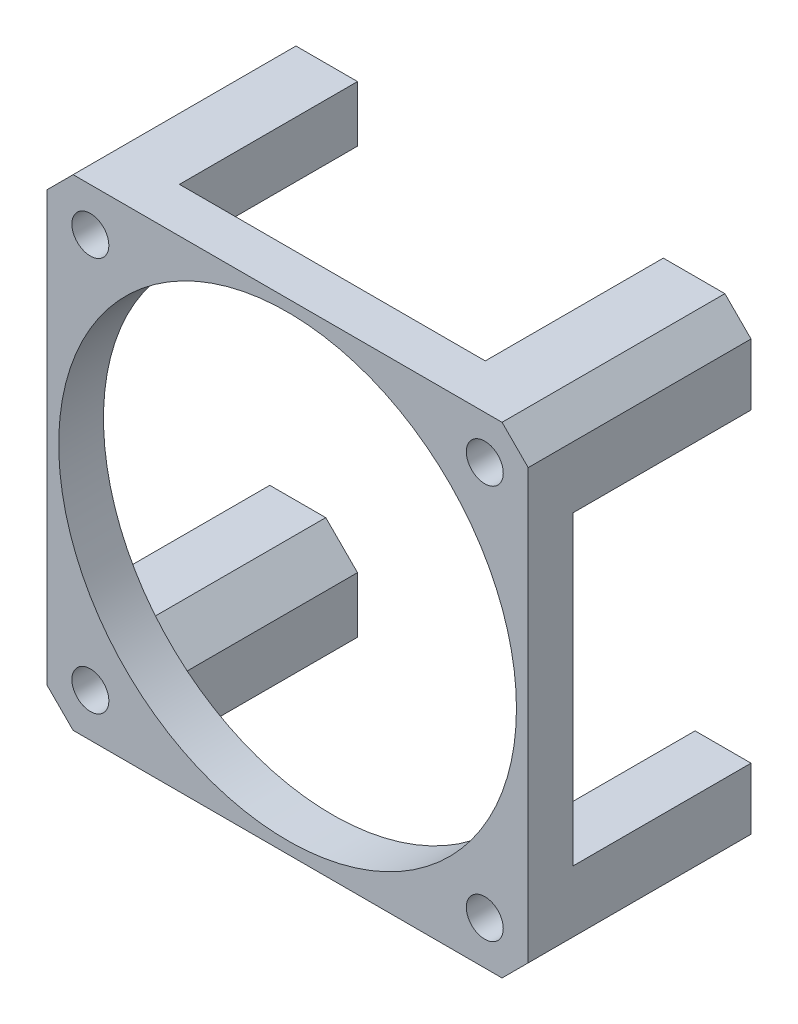
ISO-10303-21;
HEADER;
FILE_DESCRIPTION(('STEP AP214'),'2;1');
FILE_NAME('part.step','',(''),(''),'','','');
FILE_SCHEMA(('AUTOMOTIVE_DESIGN { 1 0 10303 214 1 1 1 1 }'));
ENDSEC;
DATA;
#1=APPLICATION_CONTEXT('core data for automotive mechanical design processes');
#2=APPLICATION_PROTOCOL_DEFINITION('international standard','automotive_design',2000,#1);
#3=PRODUCT_CONTEXT('',#1,'mechanical');
#4=PRODUCT('Part','Part','',(#3));
#5=PRODUCT_RELATED_PRODUCT_CATEGORY('part','',(#4));
#6=PRODUCT_DEFINITION_FORMATION('','',#4);
#7=PRODUCT_DEFINITION_CONTEXT('part definition',#1,'design');
#8=PRODUCT_DEFINITION('design','',#6,#7);
#9=PRODUCT_DEFINITION_SHAPE('','',#8);
#10=(LENGTH_UNIT() NAMED_UNIT(*) SI_UNIT(.MILLI.,.METRE.));
#11=(NAMED_UNIT(*) PLANE_ANGLE_UNIT() SI_UNIT($,.RADIAN.));
#12=(NAMED_UNIT(*) SI_UNIT($,.STERADIAN.) SOLID_ANGLE_UNIT());
#13=UNCERTAINTY_MEASURE_WITH_UNIT(LENGTH_MEASURE(1.E-05),#10,'distance_accuracy_value','');
#14=(GEOMETRIC_REPRESENTATION_CONTEXT(3) GLOBAL_UNCERTAINTY_ASSIGNED_CONTEXT((#13)) GLOBAL_UNIT_ASSIGNED_CONTEXT((#10,
#11,#12)) REPRESENTATION_CONTEXT('',''));
#15=CARTESIAN_POINT('',(0.,0.,0.));
#16=DIRECTION('',(0.,0.,1.));
#17=DIRECTION('',(1.,0.,0.));
#18=AXIS2_PLACEMENT_3D('',#15,#16,#17);
#19=CARTESIAN_POINT('',(0.,0.,0.));
#20=DIRECTION('',(0.,0.,1.));
#21=DIRECTION('',(1.,0.,0.));
#22=AXIS2_PLACEMENT_3D('',#19,#20,#21);
#23=PLANE('',#22);
#24=CARTESIAN_POINT('',(0.,0.,0.));
#25=DIRECTION('',(0.,0.,1.));
#26=DIRECTION('',(1.,0.,0.));
#27=AXIS2_PLACEMENT_3D('',#24,#25,#26);
#28=CIRCLE('',#27,20.45);
#29=CARTESIAN_POINT('',(20.45,0.,0.));
#30=VERTEX_POINT('',#29);
#31=EDGE_CURVE('E424',#30,#30,#28,.T.);
#32=ORIENTED_EDGE('',*,*,#31,.T.);
#33=EDGE_LOOP('',(#32));
#34=FACE_BOUND('',#33,.T.);
#35=DIRECTION('',(1.,0.,0.));
#36=VECTOR('',#35,1.);
#37=CARTESIAN_POINT('',(0.,-21.5,0.));
#38=LINE('',#37,#36);
#39=CARTESIAN_POINT('',(-13.6622023786411,-21.5,0.));
#40=VERTEX_POINT('',#39);
#41=CARTESIAN_POINT('',(13.6622023786411,-21.5,0.));
#42=VERTEX_POINT('',#41);
#43=EDGE_CURVE('E473',#40,#42,#38,.T.);
#44=ORIENTED_EDGE('',*,*,#43,.F.);
#45=DIRECTION('',(0.,1.,0.));
#46=VECTOR('',#45,1.);
#47=CARTESIAN_POINT('',(-13.6622023786411,0.,0.));
#48=LINE('',#47,#46);
#49=CARTESIAN_POINT('',(-13.6622023786411,-16.5,0.));
#50=VERTEX_POINT('',#49);
#51=EDGE_CURVE('E63',#40,#50,#48,.T.);
#52=ORIENTED_EDGE('',*,*,#51,.T.);
#53=DIRECTION('',(-0.707106781186548,0.707106781186548,0.));
#54=VECTOR('',#53,1.);
#55=CARTESIAN_POINT('',(-15.0811011893205,-15.0811011893205,0.));
#56=LINE('',#55,#54);
#57=CARTESIAN_POINT('',(-16.5,-13.6622023786411,0.));
#58=VERTEX_POINT('',#57);
#59=EDGE_CURVE('E213',#50,#58,#56,.T.);
#60=ORIENTED_EDGE('',*,*,#59,.T.);
#61=DIRECTION('',(1.,0.,0.));
#62=VECTOR('',#61,1.);
#63=CARTESIAN_POINT('',(0.,-13.6622023786411,0.));
#64=LINE('',#63,#62);
#65=CARTESIAN_POINT('',(-21.5,-13.6622023786411,0.));
#66=VERTEX_POINT('',#65);
#67=EDGE_CURVE('E238',#66,#58,#64,.T.);
#68=ORIENTED_EDGE('',*,*,#67,.F.);
#69=DIRECTION('',(0.,-1.,0.));
#70=VECTOR('',#69,1.);
#71=CARTESIAN_POINT('',(-21.5,0.,0.));
#72=LINE('',#71,#70);
#73=CARTESIAN_POINT('',(-21.5,13.6622023786411,0.));
#74=VERTEX_POINT('',#73);
#75=EDGE_CURVE('E469',#74,#66,#72,.T.);
#76=ORIENTED_EDGE('',*,*,#75,.F.);
#77=DIRECTION('',(1.,0.,0.));
#78=VECTOR('',#77,1.);
#79=CARTESIAN_POINT('',(0.,13.6622023786411,0.));
#80=LINE('',#79,#78);
#81=CARTESIAN_POINT('',(-16.5,13.6622023786411,0.));
#82=VERTEX_POINT('',#81);
#83=EDGE_CURVE('E71',#74,#82,#80,.T.);
#84=ORIENTED_EDGE('',*,*,#83,.T.);
#85=DIRECTION('',(0.707106781186546,0.707106781186549,0.));
#86=VECTOR('',#85,1.);
#87=CARTESIAN_POINT('',(-15.0811011893206,15.0811011893205,0.));
#88=LINE('',#87,#86);
#89=CARTESIAN_POINT('',(-13.6622023786411,16.5,0.));
#90=VERTEX_POINT('',#89);
#91=EDGE_CURVE('E262',#82,#90,#88,.T.);
#92=ORIENTED_EDGE('',*,*,#91,.T.);
#93=DIRECTION('',(0.,1.,0.));
#94=VECTOR('',#93,1.);
#95=CARTESIAN_POINT('',(-13.6622023786411,0.,0.));
#96=LINE('',#95,#94);
#97=CARTESIAN_POINT('',(-13.6622023786411,21.5,0.));
#98=VERTEX_POINT('',#97);
#99=EDGE_CURVE('E300',#90,#98,#96,.T.);
#100=ORIENTED_EDGE('',*,*,#99,.T.);
#101=DIRECTION('',(-1.,0.,0.));
#102=VECTOR('',#101,1.);
#103=CARTESIAN_POINT('',(0.,21.5,0.));
#104=LINE('',#103,#102);
#105=CARTESIAN_POINT('',(13.6622023786411,21.5,0.));
#106=VERTEX_POINT('',#105);
#107=EDGE_CURVE('E408',#106,#98,#104,.T.);
#108=ORIENTED_EDGE('',*,*,#107,.F.);
#109=DIRECTION('',(0.,-1.,0.));
#110=VECTOR('',#109,1.);
#111=CARTESIAN_POINT('',(13.6622023786411,0.,0.));
#112=LINE('',#111,#110);
#113=CARTESIAN_POINT('',(13.6622023786411,16.5,0.));
#114=VERTEX_POINT('',#113);
#115=EDGE_CURVE('E323',#106,#114,#112,.T.);
#116=ORIENTED_EDGE('',*,*,#115,.T.);
#117=DIRECTION('',(-0.707106781186548,0.707106781186548,0.));
#118=VECTOR('',#117,1.);
#119=CARTESIAN_POINT('',(15.0811011893206,15.0811011893206,0.));
#120=LINE('',#119,#118);
#121=CARTESIAN_POINT('',(16.5,13.6622023786411,0.));
#122=VERTEX_POINT('',#121);
#123=EDGE_CURVE('E309',#122,#114,#120,.T.);
#124=ORIENTED_EDGE('',*,*,#123,.F.);
#125=DIRECTION('',(-1.,0.,0.));
#126=VECTOR('',#125,1.);
#127=CARTESIAN_POINT('',(0.,13.6622023786411,0.));
#128=LINE('',#127,#126);
#129=CARTESIAN_POINT('',(21.5,13.6622023786411,0.));
#130=VERTEX_POINT('',#129);
#131=EDGE_CURVE('E349',#130,#122,#128,.T.);
#132=ORIENTED_EDGE('',*,*,#131,.F.);
#133=DIRECTION('',(0.,1.,0.));
#134=VECTOR('',#133,1.);
#135=CARTESIAN_POINT('',(21.5,0.,0.));
#136=LINE('',#135,#134);
#137=CARTESIAN_POINT('',(21.5,-13.6622023786411,0.));
#138=VERTEX_POINT('',#137);
#139=EDGE_CURVE('E476',#138,#130,#136,.T.);
#140=ORIENTED_EDGE('',*,*,#139,.F.);
#141=DIRECTION('',(-1.,0.,0.));
#142=VECTOR('',#141,1.);
#143=CARTESIAN_POINT('',(0.,-13.6622023786411,0.));
#144=LINE('',#143,#142);
#145=CARTESIAN_POINT('',(16.5,-13.6622023786411,0.));
#146=VERTEX_POINT('',#145);
#147=EDGE_CURVE('E373',#138,#146,#144,.T.);
#148=ORIENTED_EDGE('',*,*,#147,.T.);
#149=DIRECTION('',(0.707106781186548,0.707106781186548,0.));
#150=VECTOR('',#149,1.);
#151=CARTESIAN_POINT('',(15.0811011893205,-15.0811011893205,0.));
#152=LINE('',#151,#150);
#153=CARTESIAN_POINT('',(13.6622023786411,-16.5,0.));
#154=VERTEX_POINT('',#153);
#155=EDGE_CURVE('E358',#154,#146,#152,.T.);
#156=ORIENTED_EDGE('',*,*,#155,.F.);
#157=DIRECTION('',(0.,1.,0.));
#158=VECTOR('',#157,1.);
#159=CARTESIAN_POINT('',(13.6622023786411,0.,0.));
#160=LINE('',#159,#158);
#161=EDGE_CURVE('E398',#42,#154,#160,.T.);
#162=ORIENTED_EDGE('',*,*,#161,.F.);
#163=EDGE_LOOP('',(#44,#52,#60,#68,#76,#84,#92,#100,#108,#116,#124,#132,#140,#148,#156,#162));
#164=FACE_BOUND('',#163,.T.);
#165=ADVANCED_FACE('F47',(#34,#164),#23,.F.);
#166=CARTESIAN_POINT('',(0.,21.5,4.));
#167=DIRECTION('',(0.,-1.,0.));
#168=DIRECTION('',(0.,0.,-1.));
#169=AXIS2_PLACEMENT_3D('',#166,#167,#168);
#170=PLANE('',#169);
#171=DIRECTION('',(0.,0.,-1.));
#172=VECTOR('',#171,1.);
#173=CARTESIAN_POINT('',(19.1622023786411,21.5,4.));
#174=LINE('',#173,#172);
#175=CARTESIAN_POINT('',(19.1622023786411,21.5,4.));
#176=VERTEX_POINT('',#175);
#177=CARTESIAN_POINT('',(19.1622023786411,21.5,-15.91));
#178=VERTEX_POINT('',#177);
#179=EDGE_CURVE('E465',#176,#178,#174,.T.);
#180=ORIENTED_EDGE('',*,*,#179,.T.);
#181=DIRECTION('',(-1.,0.,0.));
#182=VECTOR('',#181,1.);
#183=CARTESIAN_POINT('',(0.,21.5,-15.91));
#184=LINE('',#183,#182);
#185=CARTESIAN_POINT('',(13.6622023786411,21.5,-15.91));
#186=VERTEX_POINT('',#185);
#187=EDGE_CURVE('E337',#178,#186,#184,.T.);
#188=ORIENTED_EDGE('',*,*,#187,.T.);
#189=DIRECTION('',(0.,0.,1.));
#190=VECTOR('',#189,1.);
#191=CARTESIAN_POINT('',(13.6622023786411,21.5,-15.91));
#192=LINE('',#191,#190);
#193=EDGE_CURVE('E359',#186,#106,#192,.T.);
#194=ORIENTED_EDGE('',*,*,#193,.T.);
#195=ORIENTED_EDGE('',*,*,#107,.T.);
#196=DIRECTION('',(0.,0.,1.));
#197=VECTOR('',#196,1.);
#198=CARTESIAN_POINT('',(-13.6622023786411,21.5,-15.91));
#199=LINE('',#198,#197);
#200=CARTESIAN_POINT('',(-13.6622023786411,21.5,-15.91));
#201=VERTEX_POINT('',#200);
#202=EDGE_CURVE('E313',#201,#98,#199,.T.);
#203=ORIENTED_EDGE('',*,*,#202,.F.);
#204=DIRECTION('',(-1.,0.,0.));
#205=VECTOR('',#204,1.);
#206=CARTESIAN_POINT('',(0.,21.5,-15.91));
#207=LINE('',#206,#205);
#208=CARTESIAN_POINT('',(-19.1622023786411,21.5,-15.91));
#209=VERTEX_POINT('',#208);
#210=EDGE_CURVE('E280',#201,#209,#207,.T.);
#211=ORIENTED_EDGE('',*,*,#210,.T.);
#212=DIRECTION('',(0.,0.,-1.));
#213=VECTOR('',#212,1.);
#214=CARTESIAN_POINT('',(-19.1622023786411,21.5,4.));
#215=LINE('',#214,#213);
#216=CARTESIAN_POINT('',(-19.1622023786411,21.5,4.));
#217=VERTEX_POINT('',#216);
#218=EDGE_CURVE('E11',#217,#209,#215,.T.);
#219=ORIENTED_EDGE('',*,*,#218,.F.);
#220=DIRECTION('',(-1.,0.,0.));
#221=VECTOR('',#220,1.);
#222=CARTESIAN_POINT('',(0.,21.5,4.));
#223=LINE('',#222,#221);
#224=EDGE_CURVE('E419',#176,#217,#223,.T.);
#225=ORIENTED_EDGE('',*,*,#224,.F.);
#226=EDGE_LOOP('',(#180,#188,#194,#195,#203,#211,#219,#225));
#227=FACE_BOUND('',#226,.T.);
#228=ADVANCED_FACE('F49',(#227),#170,.F.);
#229=CARTESIAN_POINT('',(-20.3311011893205,20.3311011893205,4.));
#230=DIRECTION('',(0.707106781186547,-0.707106781186547,0.));
#231=DIRECTION('',(0.707106781186548,0.707106781186548,0.));
#232=AXIS2_PLACEMENT_3D('',#229,#230,#231);
#233=PLANE('',#232);
#234=ORIENTED_EDGE('',*,*,#218,.T.);
#235=DIRECTION('',(-0.707106781186548,-0.707106781186548,0.));
#236=VECTOR('',#235,1.);
#237=CARTESIAN_POINT('',(-20.3311011893205,20.3311011893205,-15.91));
#238=LINE('',#237,#236);
#239=CARTESIAN_POINT('',(-21.5,19.1622023786411,-15.91));
#240=VERTEX_POINT('',#239);
#241=EDGE_CURVE('E284',#209,#240,#238,.T.);
#242=ORIENTED_EDGE('',*,*,#241,.T.);
#243=DIRECTION('',(0.,0.,-1.));
#244=VECTOR('',#243,1.);
#245=CARTESIAN_POINT('',(-21.5,19.1622023786411,4.));
#246=LINE('',#245,#244);
#247=CARTESIAN_POINT('',(-21.5,19.1622023786411,4.));
#248=VERTEX_POINT('',#247);
#249=EDGE_CURVE('E56',#248,#240,#246,.T.);
#250=ORIENTED_EDGE('',*,*,#249,.F.);
#251=DIRECTION('',(-0.707106781186548,-0.707106781186548,0.));
#252=VECTOR('',#251,1.);
#253=CARTESIAN_POINT('',(-20.3311011893205,20.3311011893205,4.));
#254=LINE('',#253,#252);
#255=EDGE_CURVE('E423',#217,#248,#254,.T.);
#256=ORIENTED_EDGE('',*,*,#255,.F.);
#257=EDGE_LOOP('',(#234,#242,#250,#256));
#258=FACE_BOUND('',#257,.T.);
#259=ADVANCED_FACE('F513',(#258),#233,.F.);
#260=CARTESIAN_POINT('',(-21.5,0.,4.));
#261=DIRECTION('',(1.,0.,0.));
#262=DIRECTION('',(0.,0.,-1.));
#263=AXIS2_PLACEMENT_3D('',#260,#261,#262);
#264=PLANE('',#263);
#265=ORIENTED_EDGE('',*,*,#249,.T.);
#266=DIRECTION('',(0.,-1.,0.));
#267=VECTOR('',#266,1.);
#268=CARTESIAN_POINT('',(-21.5,0.,-15.91));
#269=LINE('',#268,#267);
#270=CARTESIAN_POINT('',(-21.5,13.6622023786411,-15.91));
#271=VERTEX_POINT('',#270);
#272=EDGE_CURVE('E288',#240,#271,#269,.T.);
#273=ORIENTED_EDGE('',*,*,#272,.T.);
#274=DIRECTION('',(0.,0.,1.));
#275=VECTOR('',#274,1.);
#276=CARTESIAN_POINT('',(-21.5,13.6622023786411,-15.91));
#277=LINE('',#276,#275);
#278=EDGE_CURVE('E310',#271,#74,#277,.T.);
#279=ORIENTED_EDGE('',*,*,#278,.T.);
#280=ORIENTED_EDGE('',*,*,#75,.T.);
#281=DIRECTION('',(0.,0.,1.));
#282=VECTOR('',#281,1.);
#283=CARTESIAN_POINT('',(-21.5,-13.6622023786411,-15.91));
#284=LINE('',#283,#282);
#285=CARTESIAN_POINT('',(-21.5,-13.6622023786411,-15.91));
#286=VERTEX_POINT('',#285);
#287=EDGE_CURVE('E263',#286,#66,#284,.T.);
#288=ORIENTED_EDGE('',*,*,#287,.F.);
#289=DIRECTION('',(0.,-1.,0.));
#290=VECTOR('',#289,1.);
#291=CARTESIAN_POINT('',(-21.5,0.,-15.91));
#292=LINE('',#291,#290);
#293=CARTESIAN_POINT('',(-21.5,-19.1622023786411,-15.91));
#294=VERTEX_POINT('',#293);
#295=EDGE_CURVE('E243',#286,#294,#292,.T.);
#296=ORIENTED_EDGE('',*,*,#295,.T.);
#297=DIRECTION('',(0.,0.,-1.));
#298=VECTOR('',#297,1.);
#299=CARTESIAN_POINT('',(-21.5,-19.1622023786411,4.));
#300=LINE('',#299,#298);
#301=CARTESIAN_POINT('',(-21.5,-19.1622023786411,4.));
#302=VERTEX_POINT('',#301);
#303=EDGE_CURVE('E497',#302,#294,#300,.T.);
#304=ORIENTED_EDGE('',*,*,#303,.F.);
#305=DIRECTION('',(0.,-1.,0.));
#306=VECTOR('',#305,1.);
#307=CARTESIAN_POINT('',(-21.5,0.,4.));
#308=LINE('',#307,#306);
#309=EDGE_CURVE('E427',#248,#302,#308,.T.);
#310=ORIENTED_EDGE('',*,*,#309,.F.);
#311=EDGE_LOOP('',(#265,#273,#279,#280,#288,#296,#304,#310));
#312=FACE_BOUND('',#311,.T.);
#313=ADVANCED_FACE('F504',(#312),#264,.F.);
#314=CARTESIAN_POINT('',(-20.3311011893205,-20.3311011893205,4.));
#315=DIRECTION('',(0.707106781186547,0.707106781186547,0.));
#316=DIRECTION('',(-0.707106781186548,0.707106781186548,0.));
#317=AXIS2_PLACEMENT_3D('',#314,#315,#316);
#318=PLANE('',#317);
#319=ORIENTED_EDGE('',*,*,#303,.T.);
#320=DIRECTION('',(0.707106781186548,-0.707106781186548,0.));
#321=VECTOR('',#320,1.);
#322=CARTESIAN_POINT('',(-20.3311011893205,-20.3311011893205,-15.91));
#323=LINE('',#322,#321);
#324=CARTESIAN_POINT('',(-19.1622023786411,-21.5,-15.91));
#325=VERTEX_POINT('',#324);
#326=EDGE_CURVE('E247',#294,#325,#323,.T.);
#327=ORIENTED_EDGE('',*,*,#326,.T.);
#328=DIRECTION('',(0.,0.,-1.));
#329=VECTOR('',#328,1.);
#330=CARTESIAN_POINT('',(-19.1622023786411,-21.5,4.));
#331=LINE('',#330,#329);
#332=CARTESIAN_POINT('',(-19.1622023786411,-21.5,4.));
#333=VERTEX_POINT('',#332);
#334=EDGE_CURVE('E494',#333,#325,#331,.T.);
#335=ORIENTED_EDGE('',*,*,#334,.F.);
#336=DIRECTION('',(0.707106781186548,-0.707106781186548,0.));
#337=VECTOR('',#336,1.);
#338=CARTESIAN_POINT('',(-20.3311011893205,-20.3311011893205,4.));
#339=LINE('',#338,#337);
#340=EDGE_CURVE('E430',#302,#333,#339,.T.);
#341=ORIENTED_EDGE('',*,*,#340,.F.);
#342=EDGE_LOOP('',(#319,#327,#335,#341));
#343=FACE_BOUND('',#342,.T.);
#344=ADVANCED_FACE('F535',(#343),#318,.F.);
#345=CARTESIAN_POINT('',(0.,-21.5,4.));
#346=DIRECTION('',(0.,1.,0.));
#347=DIRECTION('',(0.,0.,1.));
#348=AXIS2_PLACEMENT_3D('',#345,#346,#347);
#349=PLANE('',#348);
#350=ORIENTED_EDGE('',*,*,#334,.T.);
#351=DIRECTION('',(1.,0.,0.));
#352=VECTOR('',#351,1.);
#353=CARTESIAN_POINT('',(0.,-21.5,-15.91));
#354=LINE('',#353,#352);
#355=CARTESIAN_POINT('',(-13.6622023786411,-21.5,-15.91));
#356=VERTEX_POINT('',#355);
#357=EDGE_CURVE('E217',#325,#356,#354,.T.);
#358=ORIENTED_EDGE('',*,*,#357,.T.);
#359=DIRECTION('',(0.,0.,1.));
#360=VECTOR('',#359,1.);
#361=CARTESIAN_POINT('',(-13.6622023786411,-21.5,-15.91));
#362=LINE('',#361,#360);
#363=EDGE_CURVE('E232',#356,#40,#362,.T.);
#364=ORIENTED_EDGE('',*,*,#363,.T.);
#365=ORIENTED_EDGE('',*,*,#43,.T.);
#366=DIRECTION('',(0.,0.,1.));
#367=VECTOR('',#366,1.);
#368=CARTESIAN_POINT('',(13.6622023786411,-21.5,-15.91));
#369=LINE('',#368,#367);
#370=CARTESIAN_POINT('',(13.6622023786411,-21.5,-15.91));
#371=VERTEX_POINT('',#370);
#372=EDGE_CURVE('E412',#371,#42,#369,.T.);
#373=ORIENTED_EDGE('',*,*,#372,.F.);
#374=DIRECTION('',(1.,0.,0.));
#375=VECTOR('',#374,1.);
#376=CARTESIAN_POINT('',(0.,-21.5,-15.91));
#377=LINE('',#376,#375);
#378=CARTESIAN_POINT('',(19.1622023786411,-21.5,-15.91));
#379=VERTEX_POINT('',#378);
#380=EDGE_CURVE('E379',#371,#379,#377,.T.);
#381=ORIENTED_EDGE('',*,*,#380,.T.);
#382=DIRECTION('',(0.,0.,-1.));
#383=VECTOR('',#382,1.);
#384=CARTESIAN_POINT('',(19.1622023786411,-21.5,4.));
#385=LINE('',#384,#383);
#386=CARTESIAN_POINT('',(19.1622023786411,-21.5,4.));
#387=VERTEX_POINT('',#386);
#388=EDGE_CURVE('E491',#387,#379,#385,.T.);
#389=ORIENTED_EDGE('',*,*,#388,.F.);
#390=DIRECTION('',(1.,0.,0.));
#391=VECTOR('',#390,1.);
#392=CARTESIAN_POINT('',(0.,-21.5,4.));
#393=LINE('',#392,#391);
#394=EDGE_CURVE('E433',#333,#387,#393,.T.);
#395=ORIENTED_EDGE('',*,*,#394,.F.);
#396=EDGE_LOOP('',(#350,#358,#364,#365,#373,#381,#389,#395));
#397=FACE_BOUND('',#396,.T.);
#398=ADVANCED_FACE('F586',(#397),#349,.F.);
#399=CARTESIAN_POINT('',(20.3311011893205,-20.3311011893205,4.));
#400=DIRECTION('',(-0.707106781186547,0.707106781186547,0.));
#401=DIRECTION('',(-0.707106781186548,-0.707106781186548,0.));
#402=AXIS2_PLACEMENT_3D('',#399,#400,#401);
#403=PLANE('',#402);
#404=ORIENTED_EDGE('',*,*,#388,.T.);
#405=DIRECTION('',(0.707106781186548,0.707106781186548,0.));
#406=VECTOR('',#405,1.);
#407=CARTESIAN_POINT('',(20.3311011893205,-20.3311011893205,-15.91));
#408=LINE('',#407,#406);
#409=CARTESIAN_POINT('',(21.5,-19.1622023786411,-15.91));
#410=VERTEX_POINT('',#409);
#411=EDGE_CURVE('E383',#379,#410,#408,.T.);
#412=ORIENTED_EDGE('',*,*,#411,.T.);
#413=DIRECTION('',(0.,0.,-1.));
#414=VECTOR('',#413,1.);
#415=CARTESIAN_POINT('',(21.5,-19.1622023786411,4.));
#416=LINE('',#415,#414);
#417=CARTESIAN_POINT('',(21.5,-19.1622023786411,4.));
#418=VERTEX_POINT('',#417);
#419=EDGE_CURVE('E488',#418,#410,#416,.T.);
#420=ORIENTED_EDGE('',*,*,#419,.F.);
#421=DIRECTION('',(0.707106781186548,0.707106781186548,0.));
#422=VECTOR('',#421,1.);
#423=CARTESIAN_POINT('',(20.3311011893205,-20.3311011893205,4.));
#424=LINE('',#423,#422);
#425=EDGE_CURVE('E436',#387,#418,#424,.T.);
#426=ORIENTED_EDGE('',*,*,#425,.F.);
#427=EDGE_LOOP('',(#404,#412,#420,#426));
#428=FACE_BOUND('',#427,.T.);
#429=ADVANCED_FACE('F591',(#428),#403,.F.);
#430=CARTESIAN_POINT('',(21.5,0.,4.));
#431=DIRECTION('',(-1.,0.,0.));
#432=DIRECTION('',(0.,0.,1.));
#433=AXIS2_PLACEMENT_3D('',#430,#431,#432);
#434=PLANE('',#433);
#435=ORIENTED_EDGE('',*,*,#419,.T.);
#436=DIRECTION('',(0.,1.,0.));
#437=VECTOR('',#436,1.);
#438=CARTESIAN_POINT('',(21.5,0.,-15.91));
#439=LINE('',#438,#437);
#440=CARTESIAN_POINT('',(21.5,-13.6622023786411,-15.91));
#441=VERTEX_POINT('',#440);
#442=EDGE_CURVE('E387',#410,#441,#439,.T.);
#443=ORIENTED_EDGE('',*,*,#442,.T.);
#444=DIRECTION('',(0.,0.,1.));
#445=VECTOR('',#444,1.);
#446=CARTESIAN_POINT('',(21.5,-13.6622023786411,-15.91));
#447=LINE('',#446,#445);
#448=EDGE_CURVE('E409',#441,#138,#447,.T.);
#449=ORIENTED_EDGE('',*,*,#448,.T.);
#450=ORIENTED_EDGE('',*,*,#139,.T.);
#451=DIRECTION('',(0.,0.,1.));
#452=VECTOR('',#451,1.);
#453=CARTESIAN_POINT('',(21.5,13.6622023786411,-15.91));
#454=LINE('',#453,#452);
#455=CARTESIAN_POINT('',(21.5,13.6622023786411,-15.91));
#456=VERTEX_POINT('',#455);
#457=EDGE_CURVE('E362',#456,#130,#454,.T.);
#458=ORIENTED_EDGE('',*,*,#457,.F.);
#459=DIRECTION('',(0.,1.,0.));
#460=VECTOR('',#459,1.);
#461=CARTESIAN_POINT('',(21.5,0.,-15.91));
#462=LINE('',#461,#460);
#463=CARTESIAN_POINT('',(21.5,19.1622023786411,-15.91));
#464=VERTEX_POINT('',#463);
#465=EDGE_CURVE('E329',#456,#464,#462,.T.);
#466=ORIENTED_EDGE('',*,*,#465,.T.);
#467=DIRECTION('',(0.,0.,-1.));
#468=VECTOR('',#467,1.);
#469=CARTESIAN_POINT('',(21.5,19.1622023786411,4.));
#470=LINE('',#469,#468);
#471=CARTESIAN_POINT('',(21.5,19.1622023786411,4.));
#472=VERTEX_POINT('',#471);
#473=EDGE_CURVE('E485',#472,#464,#470,.T.);
#474=ORIENTED_EDGE('',*,*,#473,.F.);
#475=DIRECTION('',(0.,1.,0.));
#476=VECTOR('',#475,1.);
#477=CARTESIAN_POINT('',(21.5,0.,4.));
#478=LINE('',#477,#476);
#479=EDGE_CURVE('E439',#418,#472,#478,.T.);
#480=ORIENTED_EDGE('',*,*,#479,.F.);
#481=EDGE_LOOP('',(#435,#443,#449,#450,#458,#466,#474,#480));
#482=FACE_BOUND('',#481,.T.);
#483=ADVANCED_FACE('F569',(#482),#434,.F.);
#484=CARTESIAN_POINT('',(-17.62115687683,-17.62115687683,4.));
#485=DIRECTION('',(0.,0.,-1.));
#486=DIRECTION('',(-1.,0.,0.));
#487=AXIS2_PLACEMENT_3D('',#484,#485,#486);
#488=CYLINDRICAL_SURFACE('',#487,1.65008079549024);
#489=CARTESIAN_POINT('',(-17.62115687683,-17.62115687683,4.));
#490=DIRECTION('',(0.,0.,1.));
#491=DIRECTION('',(1.,0.,0.));
#492=AXIS2_PLACEMENT_3D('',#489,#490,#491);
#493=CIRCLE('',#492,1.65008079549024);
#494=CARTESIAN_POINT('',(-15.9710760813397,-17.62115687683,4.));
#495=VERTEX_POINT('',#494);
#496=EDGE_CURVE('E457',#495,#495,#493,.T.);
#497=ORIENTED_EDGE('',*,*,#496,.T.);
#498=EDGE_LOOP('',(#497));
#499=FACE_BOUND('',#498,.T.);
#500=CARTESIAN_POINT('',(-17.62115687683,-17.62115687683,-15.91));
#501=DIRECTION('',(0.,0.,1.));
#502=DIRECTION('',(1.,0.,0.));
#503=AXIS2_PLACEMENT_3D('',#500,#501,#502);
#504=CIRCLE('',#503,1.65008079549024);
#505=CARTESIAN_POINT('',(-15.9710760813397,-17.62115687683,-15.91));
#506=VERTEX_POINT('',#505);
#507=EDGE_CURVE('E234',#506,#506,#504,.T.);
#508=ORIENTED_EDGE('',*,*,#507,.F.);
#509=EDGE_LOOP('',(#508));
#510=FACE_BOUND('',#509,.T.);
#511=ADVANCED_FACE('F619',(#499,#510),#488,.F.);
#512=CARTESIAN_POINT('',(17.62115687683,-17.62115687683,4.));
#513=DIRECTION('',(0.,0.,-1.));
#514=DIRECTION('',(-1.,0.,0.));
#515=AXIS2_PLACEMENT_3D('',#512,#513,#514);
#516=CYLINDRICAL_SURFACE('',#515,1.65);
#517=CARTESIAN_POINT('',(17.62115687683,-17.62115687683,4.));
#518=DIRECTION('',(0.,0.,1.));
#519=DIRECTION('',(1.,0.,0.));
#520=AXIS2_PLACEMENT_3D('',#517,#518,#519);
#521=CIRCLE('',#520,1.65);
#522=CARTESIAN_POINT('',(19.27115687683,-17.62115687683,4.));
#523=VERTEX_POINT('',#522);
#524=EDGE_CURVE('E453',#523,#523,#521,.T.);
#525=ORIENTED_EDGE('',*,*,#524,.T.);
#526=EDGE_LOOP('',(#525));
#527=FACE_BOUND('',#526,.T.);
#528=CARTESIAN_POINT('',(17.62115687683,-17.62115687683,-15.91));
#529=DIRECTION('',(0.,0.,1.));
#530=DIRECTION('',(1.,0.,0.));
#531=AXIS2_PLACEMENT_3D('',#528,#529,#530);
#532=CIRCLE('',#531,1.65);
#533=CARTESIAN_POINT('',(19.27115687683,-17.62115687683,-15.91));
#534=VERTEX_POINT('',#533);
#535=EDGE_CURVE('E368',#534,#534,#532,.T.);
#536=ORIENTED_EDGE('',*,*,#535,.F.);
#537=EDGE_LOOP('',(#536));
#538=FACE_BOUND('',#537,.T.);
#539=ADVANCED_FACE('F622',(#527,#538),#516,.F.);
#540=CARTESIAN_POINT('',(17.62115687683,17.62115687683,4.));
#541=DIRECTION('',(0.,0.,-1.));
#542=DIRECTION('',(-1.,0.,0.));
#543=AXIS2_PLACEMENT_3D('',#540,#541,#542);
#544=CYLINDRICAL_SURFACE('',#543,1.65);
#545=CARTESIAN_POINT('',(17.62115687683,17.62115687683,4.));
#546=DIRECTION('',(0.,0.,1.));
#547=DIRECTION('',(1.,0.,0.));
#548=AXIS2_PLACEMENT_3D('',#545,#546,#547);
#549=CIRCLE('',#548,1.65);
#550=CARTESIAN_POINT('',(19.27115687683,17.62115687683,4.));
#551=VERTEX_POINT('',#550);
#552=EDGE_CURVE('E449',#551,#551,#549,.T.);
#553=ORIENTED_EDGE('',*,*,#552,.T.);
#554=EDGE_LOOP('',(#553));
#555=FACE_BOUND('',#554,.T.);
#556=CARTESIAN_POINT('',(17.62115687683,17.62115687683,-15.91));
#557=DIRECTION('',(0.,0.,1.));
#558=DIRECTION('',(1.,0.,0.));
#559=AXIS2_PLACEMENT_3D('',#556,#557,#558);
#560=CIRCLE('',#559,1.65);
#561=CARTESIAN_POINT('',(19.27115687683,17.62115687683,-15.91));
#562=VERTEX_POINT('',#561);
#563=EDGE_CURVE('E318',#562,#562,#560,.T.);
#564=ORIENTED_EDGE('',*,*,#563,.F.);
#565=EDGE_LOOP('',(#564));
#566=FACE_BOUND('',#565,.T.);
#567=ADVANCED_FACE('F626',(#555,#566),#544,.F.);
#568=CARTESIAN_POINT('',(0.,0.,4.));
#569=DIRECTION('',(0.,0.,-1.));
#570=DIRECTION('',(-1.,0.,0.));
#571=AXIS2_PLACEMENT_3D('',#568,#569,#570);
#572=CYLINDRICAL_SURFACE('',#571,20.45);
#573=CARTESIAN_POINT('',(0.,0.,4.));
#574=DIRECTION('',(0.,0.,1.));
#575=DIRECTION('',(1.,0.,0.));
#576=AXIS2_PLACEMENT_3D('',#573,#574,#575);
#577=CIRCLE('',#576,20.45);
#578=CARTESIAN_POINT('',(20.45,0.,4.));
#579=VERTEX_POINT('',#578);
#580=EDGE_CURVE('E445',#579,#579,#577,.T.);
#581=ORIENTED_EDGE('',*,*,#580,.T.);
#582=EDGE_LOOP('',(#581));
#583=FACE_BOUND('',#582,.T.);
#584=ORIENTED_EDGE('',*,*,#31,.F.);
#585=EDGE_LOOP('',(#584));
#586=FACE_BOUND('',#585,.T.);
#587=ADVANCED_FACE('F630',(#583,#586),#572,.F.);
#588=CARTESIAN_POINT('',(20.3311011893205,20.3311011893205,4.));
#589=DIRECTION('',(-0.707106781186547,-0.707106781186547,0.));
#590=DIRECTION('',(0.707106781186548,-0.707106781186548,0.));
#591=AXIS2_PLACEMENT_3D('',#588,#589,#590);
#592=PLANE('',#591);
#593=ORIENTED_EDGE('',*,*,#473,.T.);
#594=DIRECTION('',(-0.707106781186548,0.707106781186548,0.));
#595=VECTOR('',#594,1.);
#596=CARTESIAN_POINT('',(20.3311011893205,20.3311011893205,-15.91));
#597=LINE('',#596,#595);
#598=EDGE_CURVE('E333',#464,#178,#597,.T.);
#599=ORIENTED_EDGE('',*,*,#598,.T.);
#600=ORIENTED_EDGE('',*,*,#179,.F.);
#601=DIRECTION('',(-0.707106781186548,0.707106781186548,0.));
#602=VECTOR('',#601,1.);
#603=CARTESIAN_POINT('',(20.3311011893205,20.3311011893205,4.));
#604=LINE('',#603,#602);
#605=EDGE_CURVE('E442',#472,#176,#604,.T.);
#606=ORIENTED_EDGE('',*,*,#605,.F.);
#607=EDGE_LOOP('',(#593,#599,#600,#606));
#608=FACE_BOUND('',#607,.T.);
#609=ADVANCED_FACE('F546',(#608),#592,.F.);
#610=CARTESIAN_POINT('',(-17.62115687683,17.62115687683,4.));
#611=DIRECTION('',(0.,0.,-1.));
#612=DIRECTION('',(-1.,0.,0.));
#613=AXIS2_PLACEMENT_3D('',#610,#611,#612);
#614=CYLINDRICAL_SURFACE('',#613,1.65);
#615=CARTESIAN_POINT('',(-17.62115687683,17.62115687683,4.));
#616=DIRECTION('',(0.,0.,1.));
#617=DIRECTION('',(1.,0.,0.));
#618=AXIS2_PLACEMENT_3D('',#615,#616,#617);
#619=CIRCLE('',#618,1.65);
#620=CARTESIAN_POINT('',(-15.97115687683,17.62115687683,4.));
#621=VERTEX_POINT('',#620);
#622=EDGE_CURVE('E461',#621,#621,#619,.T.);
#623=ORIENTED_EDGE('',*,*,#622,.T.);
#624=EDGE_LOOP('',(#623));
#625=FACE_BOUND('',#624,.T.);
#626=CARTESIAN_POINT('',(-17.62115687683,17.62115687683,-15.91));
#627=DIRECTION('',(0.,0.,1.));
#628=DIRECTION('',(1.,0.,0.));
#629=AXIS2_PLACEMENT_3D('',#626,#627,#628);
#630=CIRCLE('',#629,1.65);
#631=CARTESIAN_POINT('',(-15.97115687683,17.62115687683,-15.91));
#632=VERTEX_POINT('',#631);
#633=EDGE_CURVE('E268',#632,#632,#630,.T.);
#634=ORIENTED_EDGE('',*,*,#633,.F.);
#635=EDGE_LOOP('',(#634));
#636=FACE_BOUND('',#635,.T.);
#637=ADVANCED_FACE('F615',(#625,#636),#614,.F.);
#638=CARTESIAN_POINT('',(0.,0.,4.));
#639=DIRECTION('',(0.,0.,1.));
#640=DIRECTION('',(1.,0.,0.));
#641=AXIS2_PLACEMENT_3D('',#638,#639,#640);
#642=PLANE('',#641);
#643=ORIENTED_EDGE('',*,*,#224,.T.);
#644=ORIENTED_EDGE('',*,*,#255,.T.);
#645=ORIENTED_EDGE('',*,*,#309,.T.);
#646=ORIENTED_EDGE('',*,*,#340,.T.);
#647=ORIENTED_EDGE('',*,*,#394,.T.);
#648=ORIENTED_EDGE('',*,*,#425,.T.);
#649=ORIENTED_EDGE('',*,*,#479,.T.);
#650=ORIENTED_EDGE('',*,*,#605,.T.);
#651=EDGE_LOOP('',(#643,#644,#645,#646,#647,#648,#649,#650));
#652=FACE_BOUND('',#651,.T.);
#653=ORIENTED_EDGE('',*,*,#580,.F.);
#654=EDGE_LOOP('',(#653));
#655=FACE_BOUND('',#654,.T.);
#656=ORIENTED_EDGE('',*,*,#552,.F.);
#657=EDGE_LOOP('',(#656));
#658=FACE_BOUND('',#657,.T.);
#659=ORIENTED_EDGE('',*,*,#524,.F.);
#660=EDGE_LOOP('',(#659));
#661=FACE_BOUND('',#660,.T.);
#662=ORIENTED_EDGE('',*,*,#496,.F.);
#663=EDGE_LOOP('',(#662));
#664=FACE_BOUND('',#663,.T.);
#665=ORIENTED_EDGE('',*,*,#622,.F.);
#666=EDGE_LOOP('',(#665));
#667=FACE_BOUND('',#666,.T.);
#668=ADVANCED_FACE('F538',(#652,#655,#658,#661,#664,#667),#642,.T.);
#669=CARTESIAN_POINT('',(15.0811011893205,-15.0811011893205,-15.91));
#670=DIRECTION('',(0.707106781186548,-0.707106781186548,0.));
#671=DIRECTION('',(0.707106781186548,0.707106781186548,0.));
#672=AXIS2_PLACEMENT_3D('',#669,#670,#671);
#673=PLANE('',#672);
#674=ORIENTED_EDGE('',*,*,#155,.T.);
#675=DIRECTION('',(0.,0.,1.));
#676=VECTOR('',#675,1.);
#677=CARTESIAN_POINT('',(16.5,-13.6622023786411,-15.91));
#678=LINE('',#677,#676);
#679=CARTESIAN_POINT('',(16.5,-13.6622023786411,-15.91));
#680=VERTEX_POINT('',#679);
#681=EDGE_CURVE('E404',#680,#146,#678,.T.);
#682=ORIENTED_EDGE('',*,*,#681,.F.);
#683=DIRECTION('',(0.707106781186548,0.707106781186548,0.));
#684=VECTOR('',#683,1.);
#685=CARTESIAN_POINT('',(15.0811011893205,-15.0811011893205,-15.91));
#686=LINE('',#685,#684);
#687=CARTESIAN_POINT('',(13.6622023786411,-16.5,-15.91));
#688=VERTEX_POINT('',#687);
#689=EDGE_CURVE('E372',#688,#680,#686,.T.);
#690=ORIENTED_EDGE('',*,*,#689,.F.);
#691=DIRECTION('',(0.,0.,1.));
#692=VECTOR('',#691,1.);
#693=CARTESIAN_POINT('',(13.6622023786411,-16.5,-15.91));
#694=LINE('',#693,#692);
#695=EDGE_CURVE('E395',#688,#154,#694,.T.);
#696=ORIENTED_EDGE('',*,*,#695,.T.);
#697=EDGE_LOOP('',(#674,#682,#690,#696));
#698=FACE_BOUND('',#697,.T.);
#699=ADVANCED_FACE('F579',(#698),#673,.F.);
#700=CARTESIAN_POINT('',(0.,-13.6622023786411,-15.91));
#701=DIRECTION('',(0.,1.,0.));
#702=DIRECTION('',(0.,0.,1.));
#703=AXIS2_PLACEMENT_3D('',#700,#701,#702);
#704=PLANE('',#703);
#705=ORIENTED_EDGE('',*,*,#147,.F.);
#706=ORIENTED_EDGE('',*,*,#448,.F.);
#707=DIRECTION('',(-1.,0.,0.));
#708=VECTOR('',#707,1.);
#709=CARTESIAN_POINT('',(0.,-13.6622023786411,-15.91));
#710=LINE('',#709,#708);
#711=EDGE_CURVE('E391',#441,#680,#710,.T.);
#712=ORIENTED_EDGE('',*,*,#711,.T.);
#713=ORIENTED_EDGE('',*,*,#681,.T.);
#714=EDGE_LOOP('',(#705,#706,#712,#713));
#715=FACE_BOUND('',#714,.T.);
#716=ADVANCED_FACE('F574',(#715),#704,.T.);
#717=CARTESIAN_POINT('',(13.6622023786411,0.,-15.91));
#718=DIRECTION('',(1.,0.,0.));
#719=DIRECTION('',(0.,0.,-1.));
#720=AXIS2_PLACEMENT_3D('',#717,#718,#719);
#721=PLANE('',#720);
#722=ORIENTED_EDGE('',*,*,#161,.T.);
#723=ORIENTED_EDGE('',*,*,#695,.F.);
#724=DIRECTION('',(0.,1.,0.));
#725=VECTOR('',#724,1.);
#726=CARTESIAN_POINT('',(13.6622023786411,0.,-15.91));
#727=LINE('',#726,#725);
#728=EDGE_CURVE('E376',#371,#688,#727,.T.);
#729=ORIENTED_EDGE('',*,*,#728,.F.);
#730=ORIENTED_EDGE('',*,*,#372,.T.);
#731=EDGE_LOOP('',(#722,#723,#729,#730));
#732=FACE_BOUND('',#731,.T.);
#733=ADVANCED_FACE('F583',(#732),#721,.F.);
#734=CARTESIAN_POINT('',(0.,0.,-15.91));
#735=DIRECTION('',(0.,0.,1.));
#736=DIRECTION('',(1.,0.,0.));
#737=AXIS2_PLACEMENT_3D('',#734,#735,#736);
#738=PLANE('',#737);
#739=ORIENTED_EDGE('',*,*,#535,.T.);
#740=EDGE_LOOP('',(#739));
#741=FACE_BOUND('',#740,.T.);
#742=ORIENTED_EDGE('',*,*,#689,.T.);
#743=ORIENTED_EDGE('',*,*,#711,.F.);
#744=ORIENTED_EDGE('',*,*,#442,.F.);
#745=ORIENTED_EDGE('',*,*,#411,.F.);
#746=ORIENTED_EDGE('',*,*,#380,.F.);
#747=ORIENTED_EDGE('',*,*,#728,.T.);
#748=EDGE_LOOP('',(#742,#743,#744,#745,#746,#747));
#749=FACE_BOUND('',#748,.T.);
#750=ADVANCED_FACE('F594',(#741,#749),#738,.F.);
#751=CARTESIAN_POINT('',(15.0811011893206,15.0811011893206,-15.91));
#752=DIRECTION('',(0.707106781186548,0.707106781186548,0.));
#753=DIRECTION('',(-0.707106781186548,0.707106781186548,0.));
#754=AXIS2_PLACEMENT_3D('',#751,#752,#753);
#755=PLANE('',#754);
#756=ORIENTED_EDGE('',*,*,#123,.T.);
#757=DIRECTION('',(0.,0.,1.));
#758=VECTOR('',#757,1.);
#759=CARTESIAN_POINT('',(13.6622023786411,16.5,-15.91));
#760=LINE('',#759,#758);
#761=CARTESIAN_POINT('',(13.6622023786411,16.5,-15.91));
#762=VERTEX_POINT('',#761);
#763=EDGE_CURVE('E355',#762,#114,#760,.T.);
#764=ORIENTED_EDGE('',*,*,#763,.F.);
#765=DIRECTION('',(-0.707106781186548,0.707106781186548,0.));
#766=VECTOR('',#765,1.);
#767=CARTESIAN_POINT('',(15.0811011893206,15.0811011893206,-15.91));
#768=LINE('',#767,#766);
#769=CARTESIAN_POINT('',(16.5,13.6622023786411,-15.91));
#770=VERTEX_POINT('',#769);
#771=EDGE_CURVE('E322',#770,#762,#768,.T.);
#772=ORIENTED_EDGE('',*,*,#771,.F.);
#773=DIRECTION('',(0.,0.,1.));
#774=VECTOR('',#773,1.);
#775=CARTESIAN_POINT('',(16.5,13.6622023786411,-15.91));
#776=LINE('',#775,#774);
#777=EDGE_CURVE('E345',#770,#122,#776,.T.);
#778=ORIENTED_EDGE('',*,*,#777,.T.);
#779=EDGE_LOOP('',(#756,#764,#772,#778));
#780=FACE_BOUND('',#779,.T.);
#781=ADVANCED_FACE('F563',(#780),#755,.F.);
#782=CARTESIAN_POINT('',(13.6622023786411,0.,-15.91));
#783=DIRECTION('',(-1.,0.,0.));
#784=DIRECTION('',(0.,0.,1.));
#785=AXIS2_PLACEMENT_3D('',#782,#783,#784);
#786=PLANE('',#785);
#787=ORIENTED_EDGE('',*,*,#115,.F.);
#788=ORIENTED_EDGE('',*,*,#193,.F.);
#789=DIRECTION('',(0.,-1.,0.));
#790=VECTOR('',#789,1.);
#791=CARTESIAN_POINT('',(13.6622023786411,0.,-15.91));
#792=LINE('',#791,#790);
#793=EDGE_CURVE('E341',#186,#762,#792,.T.);
#794=ORIENTED_EDGE('',*,*,#793,.T.);
#795=ORIENTED_EDGE('',*,*,#763,.T.);
#796=EDGE_LOOP('',(#787,#788,#794,#795));
#797=FACE_BOUND('',#796,.T.);
#798=ADVANCED_FACE('F557',(#797),#786,.T.);
#799=CARTESIAN_POINT('',(0.,13.6622023786411,-15.91));
#800=DIRECTION('',(0.,1.,0.));
#801=DIRECTION('',(0.,0.,1.));
#802=AXIS2_PLACEMENT_3D('',#799,#800,#801);
#803=PLANE('',#802);
#804=ORIENTED_EDGE('',*,*,#131,.T.);
#805=ORIENTED_EDGE('',*,*,#777,.F.);
#806=DIRECTION('',(-1.,0.,0.));
#807=VECTOR('',#806,1.);
#808=CARTESIAN_POINT('',(0.,13.6622023786411,-15.91));
#809=LINE('',#808,#807);
#810=EDGE_CURVE('E326',#456,#770,#809,.T.);
#811=ORIENTED_EDGE('',*,*,#810,.F.);
#812=ORIENTED_EDGE('',*,*,#457,.T.);
#813=EDGE_LOOP('',(#804,#805,#811,#812));
#814=FACE_BOUND('',#813,.T.);
#815=ADVANCED_FACE('F567',(#814),#803,.F.);
#816=CARTESIAN_POINT('',(0.,0.,-15.91));
#817=DIRECTION('',(0.,0.,1.));
#818=DIRECTION('',(1.,0.,0.));
#819=AXIS2_PLACEMENT_3D('',#816,#817,#818);
#820=PLANE('',#819);
#821=ORIENTED_EDGE('',*,*,#563,.T.);
#822=EDGE_LOOP('',(#821));
#823=FACE_BOUND('',#822,.T.);
#824=ORIENTED_EDGE('',*,*,#771,.T.);
#825=ORIENTED_EDGE('',*,*,#793,.F.);
#826=ORIENTED_EDGE('',*,*,#187,.F.);
#827=ORIENTED_EDGE('',*,*,#598,.F.);
#828=ORIENTED_EDGE('',*,*,#465,.F.);
#829=ORIENTED_EDGE('',*,*,#810,.T.);
#830=EDGE_LOOP('',(#824,#825,#826,#827,#828,#829));
#831=FACE_BOUND('',#830,.T.);
#832=ADVANCED_FACE('F551',(#823,#831),#820,.F.);
#833=CARTESIAN_POINT('',(-15.0811011893206,15.0811011893205,-15.91));
#834=DIRECTION('',(0.707106781186549,-0.707106781186546,0.));
#835=DIRECTION('',(0.707106781186546,0.707106781186549,0.));
#836=AXIS2_PLACEMENT_3D('',#833,#834,#835);
#837=PLANE('',#836);
#838=ORIENTED_EDGE('',*,*,#91,.F.);
#839=DIRECTION('',(0.,0.,1.));
#840=VECTOR('',#839,1.);
#841=CARTESIAN_POINT('',(-16.5,13.6622023786411,-15.91));
#842=LINE('',#841,#840);
#843=CARTESIAN_POINT('',(-16.5,13.6622023786411,-15.91));
#844=VERTEX_POINT('',#843);
#845=EDGE_CURVE('E306',#844,#82,#842,.T.);
#846=ORIENTED_EDGE('',*,*,#845,.F.);
#847=DIRECTION('',(0.707106781186546,0.707106781186549,0.));
#848=VECTOR('',#847,1.);
#849=CARTESIAN_POINT('',(-15.0811011893206,15.0811011893205,-15.91));
#850=LINE('',#849,#848);
#851=CARTESIAN_POINT('',(-13.6622023786411,16.5,-15.91));
#852=VERTEX_POINT('',#851);
#853=EDGE_CURVE('E272',#844,#852,#850,.T.);
#854=ORIENTED_EDGE('',*,*,#853,.T.);
#855=DIRECTION('',(0.,0.,1.));
#856=VECTOR('',#855,1.);
#857=CARTESIAN_POINT('',(-13.6622023786411,16.5,-15.91));
#858=LINE('',#857,#856);
#859=EDGE_CURVE('E296',#852,#90,#858,.T.);
#860=ORIENTED_EDGE('',*,*,#859,.T.);
#861=EDGE_LOOP('',(#838,#846,#854,#860));
#862=FACE_BOUND('',#861,.T.);
#863=ADVANCED_FACE('F523',(#862),#837,.T.);
#864=CARTESIAN_POINT('',(0.,13.6622023786411,-15.91));
#865=DIRECTION('',(0.,-1.,0.));
#866=DIRECTION('',(0.,0.,-1.));
#867=AXIS2_PLACEMENT_3D('',#864,#865,#866);
#868=PLANE('',#867);
#869=ORIENTED_EDGE('',*,*,#83,.F.);
#870=ORIENTED_EDGE('',*,*,#278,.F.);
#871=DIRECTION('',(1.,0.,0.));
#872=VECTOR('',#871,1.);
#873=CARTESIAN_POINT('',(0.,13.6622023786411,-15.91));
#874=LINE('',#873,#872);
#875=EDGE_CURVE('E292',#271,#844,#874,.T.);
#876=ORIENTED_EDGE('',*,*,#875,.T.);
#877=ORIENTED_EDGE('',*,*,#845,.T.);
#878=EDGE_LOOP('',(#869,#870,#876,#877));
#879=FACE_BOUND('',#878,.T.);
#880=ADVANCED_FACE('F524',(#879),#868,.T.);
#881=CARTESIAN_POINT('',(-13.6622023786411,0.,-15.91));
#882=DIRECTION('',(1.,0.,0.));
#883=DIRECTION('',(0.,1.,0.));
#884=AXIS2_PLACEMENT_3D('',#881,#882,#883);
#885=PLANE('',#884);
#886=ORIENTED_EDGE('',*,*,#99,.F.);
#887=ORIENTED_EDGE('',*,*,#859,.F.);
#888=DIRECTION('',(0.,1.,0.));
#889=VECTOR('',#888,1.);
#890=CARTESIAN_POINT('',(-13.6622023786411,0.,-15.91));
#891=LINE('',#890,#889);
#892=EDGE_CURVE('E276',#852,#201,#891,.T.);
#893=ORIENTED_EDGE('',*,*,#892,.T.);
#894=ORIENTED_EDGE('',*,*,#202,.T.);
#895=EDGE_LOOP('',(#886,#887,#893,#894));
#896=FACE_BOUND('',#895,.T.);
#897=ADVANCED_FACE('F520',(#896),#885,.T.);
#898=CARTESIAN_POINT('',(0.,0.,-15.91));
#899=DIRECTION('',(0.,0.,1.));
#900=DIRECTION('',(1.,0.,0.));
#901=AXIS2_PLACEMENT_3D('',#898,#899,#900);
#902=PLANE('',#901);
#903=ORIENTED_EDGE('',*,*,#633,.T.);
#904=EDGE_LOOP('',(#903));
#905=FACE_BOUND('',#904,.T.);
#906=ORIENTED_EDGE('',*,*,#853,.F.);
#907=ORIENTED_EDGE('',*,*,#875,.F.);
#908=ORIENTED_EDGE('',*,*,#272,.F.);
#909=ORIENTED_EDGE('',*,*,#241,.F.);
#910=ORIENTED_EDGE('',*,*,#210,.F.);
#911=ORIENTED_EDGE('',*,*,#892,.F.);
#912=EDGE_LOOP('',(#906,#907,#908,#909,#910,#911));
#913=FACE_BOUND('',#912,.T.);
#914=ADVANCED_FACE('F511',(#905,#913),#902,.F.);
#915=CARTESIAN_POINT('',(-13.6622023786411,0.,-15.91));
#916=DIRECTION('',(1.,0.,0.));
#917=DIRECTION('',(0.,0.,-1.));
#918=AXIS2_PLACEMENT_3D('',#915,#916,#917);
#919=PLANE('',#918);
#920=ORIENTED_EDGE('',*,*,#51,.F.);
#921=ORIENTED_EDGE('',*,*,#363,.F.);
#922=DIRECTION('',(0.,1.,0.));
#923=VECTOR('',#922,1.);
#924=CARTESIAN_POINT('',(-13.6622023786411,0.,-15.91));
#925=LINE('',#924,#923);
#926=CARTESIAN_POINT('',(-13.6622023786411,-16.5,-15.91));
#927=VERTEX_POINT('',#926);
#928=EDGE_CURVE('E223',#356,#927,#925,.T.);
#929=ORIENTED_EDGE('',*,*,#928,.T.);
#930=DIRECTION('',(0.,0.,1.));
#931=VECTOR('',#930,1.);
#932=CARTESIAN_POINT('',(-13.6622023786411,-16.5,-15.91));
#933=LINE('',#932,#931);
#934=EDGE_CURVE('E208',#927,#50,#933,.T.);
#935=ORIENTED_EDGE('',*,*,#934,.T.);
#936=EDGE_LOOP('',(#920,#921,#929,#935));
#937=FACE_BOUND('',#936,.T.);
#938=ADVANCED_FACE('F231',(#937),#919,.T.);
#939=CARTESIAN_POINT('',(0.,-13.6622023786411,-15.91));
#940=DIRECTION('',(0.,-1.,0.));
#941=DIRECTION('',(0.,0.,-1.));
#942=AXIS2_PLACEMENT_3D('',#939,#940,#941);
#943=PLANE('',#942);
#944=ORIENTED_EDGE('',*,*,#67,.T.);
#945=DIRECTION('',(0.,0.,1.));
#946=VECTOR('',#945,1.);
#947=CARTESIAN_POINT('',(-16.5,-13.6622023786411,-15.91));
#948=LINE('',#947,#946);
#949=CARTESIAN_POINT('',(-16.5,-13.6622023786411,-15.91));
#950=VERTEX_POINT('',#949);
#951=EDGE_CURVE('E216',#950,#58,#948,.T.);
#952=ORIENTED_EDGE('',*,*,#951,.F.);
#953=DIRECTION('',(1.,0.,0.));
#954=VECTOR('',#953,1.);
#955=CARTESIAN_POINT('',(0.,-13.6622023786411,-15.91));
#956=LINE('',#955,#954);
#957=EDGE_CURVE('E227',#286,#950,#956,.T.);
#958=ORIENTED_EDGE('',*,*,#957,.F.);
#959=ORIENTED_EDGE('',*,*,#287,.T.);
#960=EDGE_LOOP('',(#944,#952,#958,#959));
#961=FACE_BOUND('',#960,.T.);
#962=ADVANCED_FACE('F530',(#961),#943,.F.);
#963=CARTESIAN_POINT('',(-15.0811011893205,-15.0811011893205,-15.91));
#964=DIRECTION('',(0.707106781186548,0.707106781186548,0.));
#965=DIRECTION('',(-0.707106781186548,0.707106781186548,0.));
#966=AXIS2_PLACEMENT_3D('',#963,#964,#965);
#967=PLANE('',#966);
#968=ORIENTED_EDGE('',*,*,#59,.F.);
#969=ORIENTED_EDGE('',*,*,#934,.F.);
#970=DIRECTION('',(-0.707106781186548,0.707106781186548,0.));
#971=VECTOR('',#970,1.);
#972=CARTESIAN_POINT('',(-15.0811011893205,-15.0811011893205,-15.91));
#973=LINE('',#972,#971);
#974=EDGE_CURVE('E211',#927,#950,#973,.T.);
#975=ORIENTED_EDGE('',*,*,#974,.T.);
#976=ORIENTED_EDGE('',*,*,#951,.T.);
#977=EDGE_LOOP('',(#968,#969,#975,#976));
#978=FACE_BOUND('',#977,.T.);
#979=ADVANCED_FACE('F210',(#978),#967,.T.);
#980=CARTESIAN_POINT('',(0.,0.,-15.91));
#981=DIRECTION('',(0.,0.,1.));
#982=DIRECTION('',(1.,0.,0.));
#983=AXIS2_PLACEMENT_3D('',#980,#981,#982);
#984=PLANE('',#983);
#985=ORIENTED_EDGE('',*,*,#507,.T.);
#986=EDGE_LOOP('',(#985));
#987=FACE_BOUND('',#986,.T.);
#988=ORIENTED_EDGE('',*,*,#928,.F.);
#989=ORIENTED_EDGE('',*,*,#357,.F.);
#990=ORIENTED_EDGE('',*,*,#326,.F.);
#991=ORIENTED_EDGE('',*,*,#295,.F.);
#992=ORIENTED_EDGE('',*,*,#957,.T.);
#993=ORIENTED_EDGE('',*,*,#974,.F.);
#994=EDGE_LOOP('',(#988,#989,#990,#991,#992,#993));
#995=FACE_BOUND('',#994,.T.);
#996=ADVANCED_FACE('F221',(#987,#995),#984,.F.);
#997=CLOSED_SHELL('',(#165,#228,#259,#313,#344,#398,#429,#483,#511,#539,#567,#587,#609,#637,
#668,#699,#716,#733,#750,#781,#798,#815,#832,#863,#880,#897,#914,#938,#962,#979,#996));
#998=MANIFOLD_SOLID_BREP('B2',#997);
#999=ADVANCED_BREP_SHAPE_REPRESENTATION('',(#18,#998),#14);
#1000=SHAPE_DEFINITION_REPRESENTATION(#9,#999);
ENDSEC;
END-ISO-10303-21;
